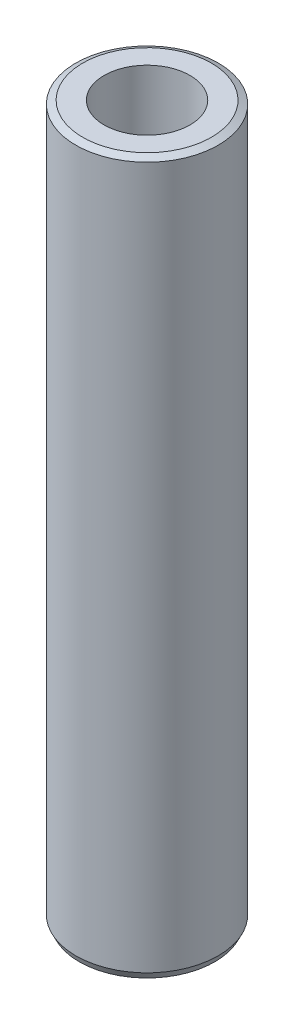
ISO-10303-21;
HEADER;
FILE_DESCRIPTION(('STEP AP214'),'2;1');
FILE_NAME('part.step','',(''),(''),'','','');
FILE_SCHEMA(('AUTOMOTIVE_DESIGN { 1 0 10303 214 1 1 1 1 }'));
ENDSEC;
DATA;
#1=APPLICATION_CONTEXT('core data for automotive mechanical design processes');
#2=APPLICATION_PROTOCOL_DEFINITION('international standard','automotive_design',2000,#1);
#3=PRODUCT_CONTEXT('',#1,'mechanical');
#4=PRODUCT('Part','Part','',(#3));
#5=PRODUCT_RELATED_PRODUCT_CATEGORY('part','',(#4));
#6=PRODUCT_DEFINITION_FORMATION('','',#4);
#7=PRODUCT_DEFINITION_CONTEXT('part definition',#1,'design');
#8=PRODUCT_DEFINITION('design','',#6,#7);
#9=PRODUCT_DEFINITION_SHAPE('','',#8);
#10=(LENGTH_UNIT() NAMED_UNIT(*) SI_UNIT(.MILLI.,.METRE.));
#11=(NAMED_UNIT(*) PLANE_ANGLE_UNIT() SI_UNIT($,.RADIAN.));
#12=(NAMED_UNIT(*) SI_UNIT($,.STERADIAN.) SOLID_ANGLE_UNIT());
#13=UNCERTAINTY_MEASURE_WITH_UNIT(LENGTH_MEASURE(1.E-05),#10,'distance_accuracy_value','');
#14=(GEOMETRIC_REPRESENTATION_CONTEXT(3) GLOBAL_UNCERTAINTY_ASSIGNED_CONTEXT((#13)) GLOBAL_UNIT_ASSIGNED_CONTEXT((#10,
#11,#12)) REPRESENTATION_CONTEXT('',''));
#15=CARTESIAN_POINT('',(0.,0.,0.));
#16=DIRECTION('',(0.,0.,1.));
#17=DIRECTION('',(1.,0.,0.));
#18=AXIS2_PLACEMENT_3D('',#15,#16,#17);
#19=CARTESIAN_POINT('',(0.,600.,0.));
#20=DIRECTION('',(0.,-1.,0.));
#21=DIRECTION('',(0.,0.,-1.));
#22=AXIS2_PLACEMENT_3D('',#19,#20,#21);
#23=CYLINDRICAL_SURFACE('',#22,60.);
#24=CARTESIAN_POINT('',(0.,597.152048161178,0.));
#25=DIRECTION('',(0.,1.,0.));
#26=DIRECTION('',(0.,0.,1.));
#27=AXIS2_PLACEMENT_3D('',#24,#25,#26);
#28=CIRCLE('',#27,60.);
#29=CARTESIAN_POINT('',(0.,597.152048161178,-60.0000000000001));
#30=VERTEX_POINT('',#29);
#31=EDGE_CURVE('E50',#30,#30,#28,.F.);
#32=ORIENTED_EDGE('',*,*,#31,.T.);
#33=EDGE_LOOP('',(#32));
#34=FACE_BOUND('',#33,.T.);
#35=CARTESIAN_POINT('',(0.,5.80433500165212,0.));
#36=DIRECTION('',(0.,1.,0.));
#37=DIRECTION('',(0.,0.,1.));
#38=AXIS2_PLACEMENT_3D('',#35,#36,#37);
#39=CIRCLE('',#38,60.);
#40=CARTESIAN_POINT('',(0.,5.80433500165212,60.));
#41=VERTEX_POINT('',#40);
#42=EDGE_CURVE('E51',#41,#41,#39,.T.);
#43=ORIENTED_EDGE('',*,*,#42,.T.);
#44=EDGE_LOOP('',(#43));
#45=FACE_BOUND('',#44,.T.);
#46=ADVANCED_FACE('F39',(#34,#45),#23,.T.);
#47=CARTESIAN_POINT('',(0.,600.,0.));
#48=DIRECTION('',(0.,1.,0.));
#49=DIRECTION('',(0.,0.,1.));
#50=AXIS2_PLACEMENT_3D('',#47,#48,#49);
#51=PLANE('',#50);
#52=CARTESIAN_POINT('',(0.,600.,0.));
#53=DIRECTION('',(0.,1.,0.));
#54=DIRECTION('',(0.,0.,1.));
#55=AXIS2_PLACEMENT_3D('',#52,#53,#54);
#56=CIRCLE('',#55,54.1956649983475);
#57=CARTESIAN_POINT('',(0.,600.,-54.1956649983476));
#58=VERTEX_POINT('',#57);
#59=EDGE_CURVE('E54',#58,#58,#56,.T.);
#60=ORIENTED_EDGE('',*,*,#59,.T.);
#61=EDGE_LOOP('',(#60));
#62=FACE_BOUND('',#61,.T.);
#63=CARTESIAN_POINT('',(0.,600.,0.));
#64=DIRECTION('',(0.,1.,0.));
#65=DIRECTION('',(0.,0.,1.));
#66=AXIS2_PLACEMENT_3D('',#63,#64,#65);
#67=CIRCLE('',#66,36.1672073823279);
#68=CARTESIAN_POINT('',(0.,600.,36.1672073823279));
#69=VERTEX_POINT('',#68);
#70=EDGE_CURVE('E58',#69,#69,#67,.T.);
#71=ORIENTED_EDGE('',*,*,#70,.F.);
#72=EDGE_LOOP('',(#71));
#73=FACE_BOUND('',#72,.T.);
#74=ADVANCED_FACE('F69',(#62,#73),#51,.T.);
#75=CARTESIAN_POINT('',(0.,0.,0.));
#76=DIRECTION('',(0.,1.,0.));
#77=DIRECTION('',(0.,0.,1.));
#78=AXIS2_PLACEMENT_3D('',#75,#76,#77);
#79=PLANE('',#78);
#80=CARTESIAN_POINT('',(0.,0.,0.));
#81=DIRECTION('',(0.,1.,0.));
#82=DIRECTION('',(0.,0.,1.));
#83=AXIS2_PLACEMENT_3D('',#80,#81,#82);
#84=CIRCLE('',#83,57.1520481611785);
#85=CARTESIAN_POINT('',(0.,0.,57.1520481611785));
#86=VERTEX_POINT('',#85);
#87=EDGE_CURVE('E10',#86,#86,#84,.F.);
#88=ORIENTED_EDGE('',*,*,#87,.T.);
#89=EDGE_LOOP('',(#88));
#90=FACE_BOUND('',#89,.T.);
#91=CARTESIAN_POINT('',(0.,0.,0.));
#92=DIRECTION('',(0.,1.,0.));
#93=DIRECTION('',(0.,0.,1.));
#94=AXIS2_PLACEMENT_3D('',#91,#92,#93);
#95=CIRCLE('',#94,36.1672073823279);
#96=CARTESIAN_POINT('',(0.,0.,36.1672073823279));
#97=VERTEX_POINT('',#96);
#98=EDGE_CURVE('E63',#97,#97,#95,.T.);
#99=ORIENTED_EDGE('',*,*,#98,.T.);
#100=EDGE_LOOP('',(#99));
#101=FACE_BOUND('',#100,.T.);
#102=ADVANCED_FACE('F75',(#90,#101),#79,.F.);
#103=CARTESIAN_POINT('',(0.,600.,0.));
#104=DIRECTION('',(0.,-1.,0.));
#105=DIRECTION('',(0.,0.,-1.));
#106=AXIS2_PLACEMENT_3D('',#103,#104,#105);
#107=CYLINDRICAL_SURFACE('',#106,36.1672073823279);
#108=ORIENTED_EDGE('',*,*,#70,.T.);
#109=EDGE_LOOP('',(#108));
#110=FACE_BOUND('',#109,.T.);
#111=ORIENTED_EDGE('',*,*,#98,.F.);
#112=EDGE_LOOP('',(#111));
#113=FACE_BOUND('',#112,.T.);
#114=ADVANCED_FACE('F70',(#110,#113),#107,.F.);
#115=CARTESIAN_POINT('',(0.,600.,0.));
#116=DIRECTION('',(0.,-1.,0.));
#117=DIRECTION('',(0.,0.,-1.));
#118=AXIS2_PLACEMENT_3D('',#115,#116,#117);
#119=CONICAL_SURFACE('',#118,54.1956649983475,1.11464903784981);
#120=CARTESIAN_POINT('',(0.,597.152048161178,-60.0000000000001));
#121=CARTESIAN_POINT('',(0.,597.181714326166,-59.9395381770662));
#122=CARTESIAN_POINT('',(0.,597.211380491154,-59.8790763541324));
#123=CARTESIAN_POINT('',(0.,597.270712821129,-59.7581527082646));
#124=CARTESIAN_POINT('',(0.,597.300378986117,-59.6976908853307));
#125=CARTESIAN_POINT('',(0.,597.359711316092,-59.5767672394629));
#126=CARTESIAN_POINT('',(0.,597.38937748108,-59.5163054165291));
#127=CARTESIAN_POINT('',(0.,597.448709811055,-59.3953817706613));
#128=CARTESIAN_POINT('',(0.,597.478375976043,-59.3349199477274));
#129=CARTESIAN_POINT('',(0.,597.537708306019,-59.2139963018597));
#130=CARTESIAN_POINT('',(0.,597.567374471006,-59.1535344789258));
#131=CARTESIAN_POINT('',(0.,597.626706800982,-59.032610833058));
#132=CARTESIAN_POINT('',(0.,597.656372965969,-58.9721490101241));
#133=CARTESIAN_POINT('',(0.,597.715705295945,-58.8512253642564));
#134=CARTESIAN_POINT('',(0.,597.745371460933,-58.7907635413225));
#135=CARTESIAN_POINT('',(0.,597.804703790908,-58.6698398954547));
#136=CARTESIAN_POINT('',(0.,597.834369955896,-58.6093780725209));
#137=CARTESIAN_POINT('',(0.,597.893702285871,-58.4884544266531));
#138=CARTESIAN_POINT('',(0.,597.923368450859,-58.4279926037192));
#139=CARTESIAN_POINT('',(0.,597.982700780835,-58.3070689578515));
#140=CARTESIAN_POINT('',(0.,598.012366945822,-58.2466071349176));
#141=CARTESIAN_POINT('',(0.,598.071699275798,-58.1256834890498));
#142=CARTESIAN_POINT('',(0.,598.101365440785,-58.0652216661159));
#143=CARTESIAN_POINT('',(0.,598.160697770761,-57.9442980202482));
#144=CARTESIAN_POINT('',(0.,598.190363935749,-57.8838361973143));
#145=CARTESIAN_POINT('',(0.,598.249696265724,-57.7629125514465));
#146=CARTESIAN_POINT('',(0.,598.279362430712,-57.7024507285127));
#147=CARTESIAN_POINT('',(0.,598.338694760687,-57.5815270826449));
#148=CARTESIAN_POINT('',(0.,598.368360925675,-57.521065259711));
#149=CARTESIAN_POINT('',(0.,598.42769325565,-57.4001416138433));
#150=CARTESIAN_POINT('',(0.,598.457359420638,-57.3396797909094));
#151=CARTESIAN_POINT('',(0.,598.516691750614,-57.2187561450416));
#152=CARTESIAN_POINT('',(0.,598.546357915601,-57.1582943221077));
#153=CARTESIAN_POINT('',(0.,598.605690245577,-57.03737067624));
#154=CARTESIAN_POINT('',(0.,598.635356410565,-56.9769088533061));
#155=CARTESIAN_POINT('',(0.,598.69468874054,-56.8559852074383));
#156=CARTESIAN_POINT('',(0.,598.724354905528,-56.7955233845044));
#157=CARTESIAN_POINT('',(0.,598.783687235503,-56.6745997386367));
#158=CARTESIAN_POINT('',(0.,598.813353400491,-56.6141379157028));
#159=CARTESIAN_POINT('',(0.,598.872685730466,-56.4932142698351));
#160=CARTESIAN_POINT('',(0.,598.902351895454,-56.4327524469012));
#161=CARTESIAN_POINT('',(0.,598.96168422543,-56.3118288010334));
#162=CARTESIAN_POINT('',(0.,598.991350390417,-56.2513669780995));
#163=CARTESIAN_POINT('',(0.,599.050682720393,-56.1304433322318));
#164=CARTESIAN_POINT('',(0.,599.08034888538,-56.0699815092979));
#165=CARTESIAN_POINT('',(0.,599.139681215356,-55.9490578634301));
#166=CARTESIAN_POINT('',(0.,599.169347380344,-55.8885960404963));
#167=CARTESIAN_POINT('',(0.,599.228679710319,-55.7676723946285));
#168=CARTESIAN_POINT('',(0.,599.258345875307,-55.7072105716946));
#169=CARTESIAN_POINT('',(0.,599.317678205282,-55.5862869258268));
#170=CARTESIAN_POINT('',(0.,599.34734437027,-55.525825102893));
#171=CARTESIAN_POINT('',(0.,599.406676700245,-55.4049014570252));
#172=CARTESIAN_POINT('',(0.,599.436342865233,-55.3444396340913));
#173=CARTESIAN_POINT('',(0.,599.495675195208,-55.2235159882236));
#174=CARTESIAN_POINT('',(0.,599.525341360196,-55.1630541652897));
#175=CARTESIAN_POINT('',(0.,599.584673690172,-55.0421305194219));
#176=CARTESIAN_POINT('',(0.,599.614339855159,-54.9816686964881));
#177=CARTESIAN_POINT('',(0.,599.673672185135,-54.8607450506203));
#178=CARTESIAN_POINT('',(0.,599.703338350123,-54.8002832276864));
#179=CARTESIAN_POINT('',(0.,599.762670680098,-54.6793595818186));
#180=CARTESIAN_POINT('',(0.,599.792336845086,-54.6188977588848));
#181=CARTESIAN_POINT('',(0.,599.851669175061,-54.497974113017));
#182=CARTESIAN_POINT('',(0.,599.881335340049,-54.4375122900831));
#183=CARTESIAN_POINT('',(0.,599.940667670024,-54.3165886442153));
#184=CARTESIAN_POINT('',(0.,599.970333835012,-54.2561268212815));
#185=CARTESIAN_POINT('',(0.,600.,-54.1956649983476));
#186=B_SPLINE_CURVE_WITH_KNOTS('',3,(#120,#121,#122,#123,#124,#125,#126,#127,#128,#129,#130,
#131,#132,#133,#134,#135,#136,#137,#138,#139,#140,#141,#142,#143,#144,#145,#146,#147,#148,#149,
#150,#151,#152,#153,#154,#155,#156,#157,#158,#159,#160,#161,#162,#163,#164,#165,#166,#167,#168,
#169,#170,#171,#172,#173,#174,#175,#176,#177,#178,#179,#180,#181,#182,#183,#184,#185),
.UNSPECIFIED.,.F.,.F.,(4,2,2,2,2,2,2,2,2,2,2,2,2,2,2,2,2,2,2,2,2,2,2,2,2,2,2,2,2,2,2,2,4),(0.,
0.20204311519597,0.404086230391946,0.60612934558797,0.808172460783946,1.01021557597997,
1.21225869117594,1.41430180637197,1.61634492156794,1.81838803676391,2.02043115195994,
2.22247426715591,2.42451738235194,2.62656049754791,2.82860361274393,3.03064672793991,
3.23268984313593,3.4347329583319,3.63677607352788,3.8388191887239,4.04086230391988,
4.2429054191159,4.44494853431187,4.6469916495079,4.84903476470387,5.05107787989984,
5.25312099509587,5.45516411029184,5.65720722548787,5.85925034068384,6.06129345587986,
6.26333657107584,6.46537968627186),.UNSPECIFIED.);
#187=EDGE_CURVE('BSEAM81',#30,#58,#186,.T.);
#188=ORIENTED_EDGE('',*,*,#31,.F.);
#189=ORIENTED_EDGE('',*,*,#59,.F.);
#190=ORIENTED_EDGE('',*,*,#187,.T.);
#191=ORIENTED_EDGE('',*,*,#187,.F.);
#192=EDGE_LOOP('',(#188,#190,#189,#191));
#193=FACE_BOUND('',#192,.T.);
#194=ADVANCED_FACE('F81',(#193),#119,.T.);
#195=CARTESIAN_POINT('',(0.,5.80433500165212,0.));
#196=DIRECTION('',(0.,1.,0.));
#197=DIRECTION('',(0.,0.,1.));
#198=AXIS2_PLACEMENT_3D('',#195,#196,#197);
#199=CONICAL_SURFACE('',#198,60.,0.456147288945073);
#200=ORIENTED_EDGE('',*,*,#87,.F.);
#201=EDGE_LOOP('',(#200));
#202=FACE_BOUND('',#201,.T.);
#203=ORIENTED_EDGE('',*,*,#42,.F.);
#204=EDGE_LOOP('',(#203));
#205=FACE_BOUND('',#204,.T.);
#206=ADVANCED_FACE('F45',(#202,#205),#199,.T.);
#207=CLOSED_SHELL('',(#46,#74,#102,#114,#194,#206));
#208=MANIFOLD_SOLID_BREP('B2',#207);
#209=ADVANCED_BREP_SHAPE_REPRESENTATION('',(#18,#208),#14);
#210=SHAPE_DEFINITION_REPRESENTATION(#9,#209);
ENDSEC;
END-ISO-10303-21;
